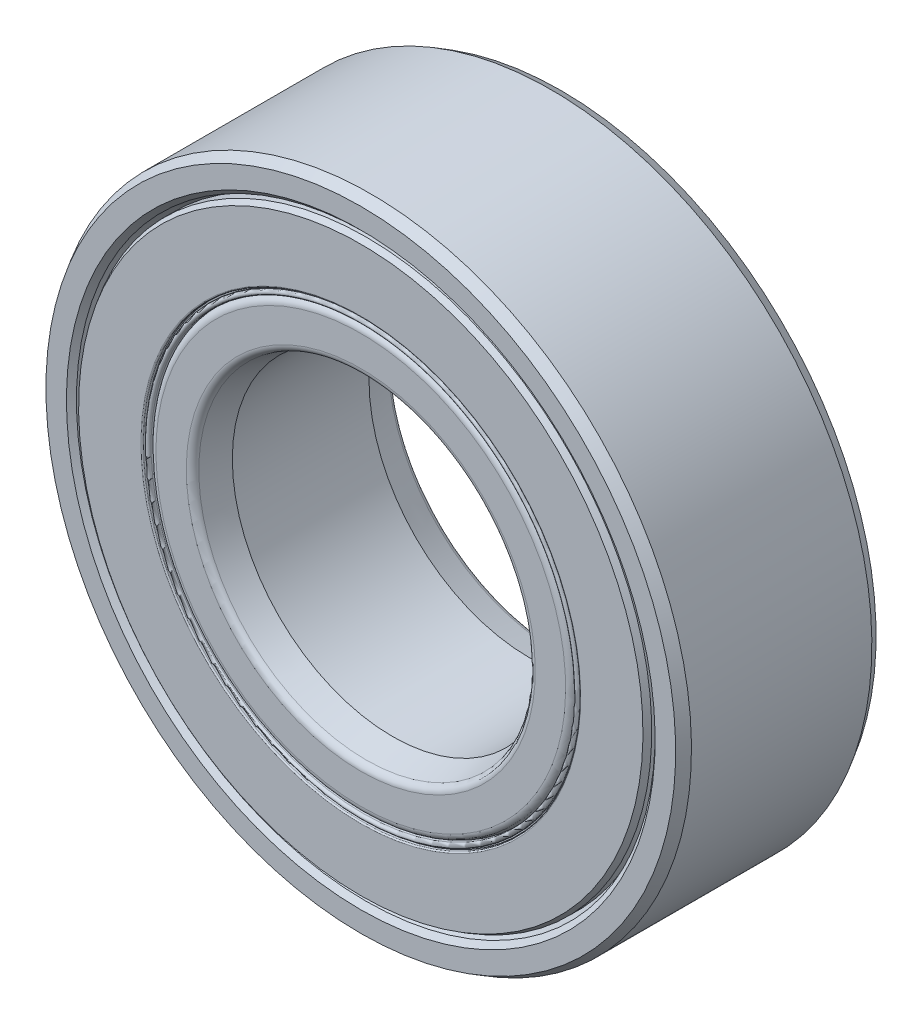
ISO-10303-21;
HEADER;
FILE_DESCRIPTION(('STEP AP214'),'2;1');
FILE_NAME('part.step','',(''),(''),'','','');
FILE_SCHEMA(('AUTOMOTIVE_DESIGN { 1 0 10303 214 1 1 1 1 }'));
ENDSEC;
DATA;
#1=APPLICATION_CONTEXT('core data for automotive mechanical design processes');
#2=APPLICATION_PROTOCOL_DEFINITION('international standard','automotive_design',2000,#1);
#3=PRODUCT_CONTEXT('',#1,'mechanical');
#4=PRODUCT('Part','Part','',(#3));
#5=PRODUCT_RELATED_PRODUCT_CATEGORY('part','',(#4));
#6=PRODUCT_DEFINITION_FORMATION('','',#4);
#7=PRODUCT_DEFINITION_CONTEXT('part definition',#1,'design');
#8=PRODUCT_DEFINITION('design','',#6,#7);
#9=PRODUCT_DEFINITION_SHAPE('','',#8);
#10=(LENGTH_UNIT() NAMED_UNIT(*) SI_UNIT(.MILLI.,.METRE.));
#11=(NAMED_UNIT(*) PLANE_ANGLE_UNIT() SI_UNIT($,.RADIAN.));
#12=(NAMED_UNIT(*) SI_UNIT($,.STERADIAN.) SOLID_ANGLE_UNIT());
#13=UNCERTAINTY_MEASURE_WITH_UNIT(LENGTH_MEASURE(1.E-05),#10,'distance_accuracy_value','');
#14=(GEOMETRIC_REPRESENTATION_CONTEXT(3) GLOBAL_UNCERTAINTY_ASSIGNED_CONTEXT((#13)) GLOBAL_UNIT_ASSIGNED_CONTEXT((#10,
#11,#12)) REPRESENTATION_CONTEXT('',''));
#15=CARTESIAN_POINT('',(0.,0.,0.));
#16=DIRECTION('',(0.,0.,1.));
#17=DIRECTION('',(1.,0.,0.));
#18=AXIS2_PLACEMENT_3D('',#15,#16,#17);
#19=CARTESIAN_POINT('',(0.,5.29333333333333,1.5));
#20=DIRECTION('',(0.,0.,1.));
#21=DIRECTION('',(0.,-1.,0.));
#22=AXIS2_PLACEMENT_3D('',#19,#20,#21);
#23=PLANE('',#22);
#24=CARTESIAN_POINT('',(0.,0.,1.5));
#25=DIRECTION('',(0.,0.,1.));
#26=DIRECTION('',(0.,-1.,0.));
#27=AXIS2_PLACEMENT_3D('',#24,#25,#26);
#28=CIRCLE('',#27,5.45333333333333);
#29=CARTESIAN_POINT('',(0.,-5.45333333333333,1.5));
#30=VERTEX_POINT('',#29);
#31=EDGE_CURVE('E11',#30,#30,#28,.T.);
#32=ORIENTED_EDGE('',*,*,#31,.F.);
#33=EDGE_LOOP('',(#32));
#34=FACE_BOUND('',#33,.T.);
#35=CARTESIAN_POINT('',(0.,0.,1.5));
#36=DIRECTION('',(0.,0.,1.));
#37=DIRECTION('',(0.,-1.,0.));
#38=AXIS2_PLACEMENT_3D('',#35,#36,#37);
#39=CIRCLE('',#38,5.29333333333333);
#40=CARTESIAN_POINT('',(0.,-5.29333333333333,1.5));
#41=VERTEX_POINT('',#40);
#42=EDGE_CURVE('E66',#41,#41,#39,.T.);
#43=ORIENTED_EDGE('',*,*,#42,.T.);
#44=EDGE_LOOP('',(#43));
#45=FACE_BOUND('',#44,.T.);
#46=ADVANCED_FACE('F41',(#34,#45),#23,.F.);
#47=CARTESIAN_POINT('',(0.,0.,2.5));
#48=DIRECTION('',(0.,0.,1.));
#49=DIRECTION('',(0.,-1.,0.));
#50=AXIS2_PLACEMENT_3D('',#47,#48,#49);
#51=CYLINDRICAL_SURFACE('',#50,5.45333333333333);
#52=CARTESIAN_POINT('',(0.,0.,2.37849954654104));
#53=DIRECTION('',(0.,0.,1.));
#54=DIRECTION('',(0.,-1.,0.));
#55=AXIS2_PLACEMENT_3D('',#52,#53,#54);
#56=CIRCLE('',#55,5.45333333333333);
#57=CARTESIAN_POINT('',(0.,-5.45333333333333,2.37849954654104));
#58=VERTEX_POINT('',#57);
#59=EDGE_CURVE('E47',#58,#58,#56,.T.);
#60=ORIENTED_EDGE('',*,*,#59,.F.);
#61=EDGE_LOOP('',(#60));
#62=FACE_BOUND('',#61,.T.);
#63=ORIENTED_EDGE('',*,*,#31,.T.);
#64=EDGE_LOOP('',(#63));
#65=FACE_BOUND('',#64,.T.);
#66=ADVANCED_FACE('F97',(#62,#65),#51,.T.);
#67=CARTESIAN_POINT('',(0.,0.,2.37849954654104));
#68=DIRECTION('',(0.,0.,-1.));
#69=DIRECTION('',(0.,1.,0.));
#70=AXIS2_PLACEMENT_3D('',#67,#68,#69);
#71=CONICAL_SURFACE('',#70,5.45333333333333,0.174532925199416);
#72=CARTESIAN_POINT('',(0.,0.,2.41789185666153));
#73=DIRECTION('',(0.,0.,1.));
#74=DIRECTION('',(0.,-1.,0.));
#75=AXIS2_PLACEMENT_3D('',#72,#73,#74);
#76=CIRCLE('',#75,5.44638740622665);
#77=CARTESIAN_POINT('',(0.,-5.44638740622665,2.41789185666153));
#78=VERTEX_POINT('',#77);
#79=EDGE_CURVE('E51',#78,#78,#76,.T.);
#80=ORIENTED_EDGE('',*,*,#79,.F.);
#81=EDGE_LOOP('',(#80));
#82=FACE_BOUND('',#81,.T.);
#83=ORIENTED_EDGE('',*,*,#59,.T.);
#84=EDGE_LOOP('',(#83));
#85=FACE_BOUND('',#84,.T.);
#86=ADVANCED_FACE('F92',(#82,#85),#71,.T.);
#87=CARTESIAN_POINT('',(0.,0.,2.415));
#88=DIRECTION('',(0.,0.,1.));
#89=DIRECTION('',(0.,-1.,0.));
#90=AXIS2_PLACEMENT_3D('',#87,#88,#89);
#91=TOROIDAL_SURFACE('',#90,5.42998687211721,0.0166535387838736);
#92=CARTESIAN_POINT('',(0.,0.,2.415));
#93=DIRECTION('',(0.,0.,1.));
#94=DIRECTION('',(0.,-1.,0.));
#95=AXIS2_PLACEMENT_3D('',#92,#93,#94);
#96=CIRCLE('',#95,5.41333333333333);
#97=CARTESIAN_POINT('',(0.,-5.41333333333333,2.415));
#98=VERTEX_POINT('',#97);
#99=EDGE_CURVE('E55',#98,#98,#96,.T.);
#100=ORIENTED_EDGE('',*,*,#99,.F.);
#101=EDGE_LOOP('',(#100));
#102=FACE_BOUND('',#101,.T.);
#103=ORIENTED_EDGE('',*,*,#79,.T.);
#104=EDGE_LOOP('',(#103));
#105=FACE_BOUND('',#104,.T.);
#106=ADVANCED_FACE('F86',(#102,#105),#91,.T.);
#107=CARTESIAN_POINT('',(0.,0.,2.5));
#108=DIRECTION('',(0.,0.,1.));
#109=DIRECTION('',(0.,-1.,0.));
#110=AXIS2_PLACEMENT_3D('',#107,#108,#109);
#111=CYLINDRICAL_SURFACE('',#110,5.41333333333333);
#112=CARTESIAN_POINT('',(0.,0.,2.44));
#113=DIRECTION('',(0.,0.,1.));
#114=DIRECTION('',(0.,-1.,0.));
#115=AXIS2_PLACEMENT_3D('',#112,#113,#114);
#116=CIRCLE('',#115,5.41333333333333);
#117=CARTESIAN_POINT('',(0.,-5.41333333333333,2.44));
#118=VERTEX_POINT('',#117);
#119=EDGE_CURVE('E60',#118,#118,#116,.T.);
#120=ORIENTED_EDGE('',*,*,#119,.F.);
#121=EDGE_LOOP('',(#120));
#122=FACE_BOUND('',#121,.T.);
#123=ORIENTED_EDGE('',*,*,#99,.T.);
#124=EDGE_LOOP('',(#123));
#125=FACE_BOUND('',#124,.T.);
#126=ADVANCED_FACE('F80',(#122,#125),#111,.T.);
#127=CARTESIAN_POINT('',(0.,0.,2.44));
#128=DIRECTION('',(0.,0.,1.));
#129=DIRECTION('',(0.,-1.,0.));
#130=AXIS2_PLACEMENT_3D('',#127,#128,#129);
#131=TOROIDAL_SURFACE('',#130,5.35333333333333,0.0600000000000002);
#132=CARTESIAN_POINT('',(0.,0.,2.44));
#133=DIRECTION('',(0.,0.,1.));
#134=DIRECTION('',(0.,-1.,0.));
#135=AXIS2_PLACEMENT_3D('',#132,#133,#134);
#136=CIRCLE('',#135,5.29333333333333);
#137=CARTESIAN_POINT('',(0.,-5.29333333333333,2.44));
#138=VERTEX_POINT('',#137);
#139=EDGE_CURVE('E63',#138,#138,#136,.T.);
#140=ORIENTED_EDGE('',*,*,#139,.F.);
#141=EDGE_LOOP('',(#140));
#142=FACE_BOUND('',#141,.T.);
#143=ORIENTED_EDGE('',*,*,#119,.T.);
#144=EDGE_LOOP('',(#143));
#145=FACE_BOUND('',#144,.T.);
#146=ADVANCED_FACE('F74',(#142,#145),#131,.T.);
#147=CARTESIAN_POINT('',(0.,0.,2.5));
#148=DIRECTION('',(0.,0.,1.));
#149=DIRECTION('',(0.,-1.,0.));
#150=AXIS2_PLACEMENT_3D('',#147,#148,#149);
#151=CYLINDRICAL_SURFACE('',#150,5.29333333333333);
#152=ORIENTED_EDGE('',*,*,#42,.F.);
#153=EDGE_LOOP('',(#152));
#154=FACE_BOUND('',#153,.T.);
#155=ORIENTED_EDGE('',*,*,#139,.T.);
#156=EDGE_LOOP('',(#155));
#157=FACE_BOUND('',#156,.T.);
#158=ADVANCED_FACE('F71',(#154,#157),#151,.F.);
#159=CLOSED_SHELL('',(#46,#66,#86,#106,#126,#146,#158));
#160=MANIFOLD_SOLID_BREP('B2',#159);
#161=CARTESIAN_POINT('',(0.,0.,-2.50000000000001));
#162=DIRECTION('',(0.,0.,1.));
#163=DIRECTION('',(0.,-1.,0.));
#164=AXIS2_PLACEMENT_3D('',#161,#162,#163);
#165=CONICAL_SURFACE('',#164,7.04,0.523598775598303);
#166=CARTESIAN_POINT('',(0.,0.,-2.3614359353945));
#167=DIRECTION('',(0.,0.,1.));
#168=DIRECTION('',(0.,-1.,0.));
#169=AXIS2_PLACEMENT_3D('',#166,#167,#168);
#170=CIRCLE('',#169,7.12);
#171=CARTESIAN_POINT('',(0.,-7.12,-2.3614359353945));
#172=VERTEX_POINT('',#171);
#173=EDGE_CURVE('E177',#172,#172,#170,.T.);
#174=ORIENTED_EDGE('',*,*,#173,.F.);
#175=EDGE_LOOP('',(#174));
#176=FACE_BOUND('',#175,.T.);
#177=CARTESIAN_POINT('',(0.,0.,-2.50000000000001));
#178=DIRECTION('',(0.,0.,1.));
#179=DIRECTION('',(0.,-1.,0.));
#180=AXIS2_PLACEMENT_3D('',#177,#178,#179);
#181=CIRCLE('',#180,7.04);
#182=CARTESIAN_POINT('',(0.,-7.04,-2.50000000000001));
#183=VERTEX_POINT('',#182);
#184=EDGE_CURVE('E40',#183,#183,#181,.T.);
#185=ORIENTED_EDGE('',*,*,#184,.T.);
#186=EDGE_LOOP('',(#185));
#187=FACE_BOUND('',#186,.T.);
#188=ADVANCED_FACE('F155',(#176,#187),#165,.T.);
#189=CARTESIAN_POINT('',(0.,7.04,-2.50000000000001));
#190=DIRECTION('',(0.,0.,1.));
#191=DIRECTION('',(0.,-1.,0.));
#192=AXIS2_PLACEMENT_3D('',#189,#190,#191);
#193=PLANE('',#192);
#194=ORIENTED_EDGE('',*,*,#184,.F.);
#195=EDGE_LOOP('',(#194));
#196=FACE_BOUND('',#195,.T.);
#197=CARTESIAN_POINT('',(0.,0.,-2.50000000000001));
#198=DIRECTION('',(0.,0.,1.));
#199=DIRECTION('',(0.,-1.,0.));
#200=AXIS2_PLACEMENT_3D('',#197,#198,#199);
#201=CIRCLE('',#200,5.48533333333333);
#202=CARTESIAN_POINT('',(0.,-5.48533333333333,-2.50000000000001));
#203=VERTEX_POINT('',#202);
#204=EDGE_CURVE('E161',#203,#203,#201,.T.);
#205=ORIENTED_EDGE('',*,*,#204,.T.);
#206=EDGE_LOOP('',(#205));
#207=FACE_BOUND('',#206,.T.);
#208=ADVANCED_FACE('F184',(#196,#207),#193,.F.);
#209=CARTESIAN_POINT('',(0.,0.,-2.46800000000001));
#210=DIRECTION('',(0.,0.,1.));
#211=DIRECTION('',(0.,-1.,0.));
#212=AXIS2_PLACEMENT_3D('',#209,#210,#211);
#213=TOROIDAL_SURFACE('',#212,5.48533333333333,0.0320000000000006);
#214=ORIENTED_EDGE('',*,*,#204,.F.);
#215=EDGE_LOOP('',(#214));
#216=FACE_BOUND('',#215,.T.);
#217=CARTESIAN_POINT('',(0.,0.,-2.46800000000001));
#218=DIRECTION('',(0.,0.,1.));
#219=DIRECTION('',(0.,-1.,0.));
#220=AXIS2_PLACEMENT_3D('',#217,#218,#219);
#221=CIRCLE('',#220,5.45333333333333);
#222=CARTESIAN_POINT('',(0.,-5.45333333333333,-2.46800000000001));
#223=VERTEX_POINT('',#222);
#224=EDGE_CURVE('E165',#223,#223,#221,.T.);
#225=ORIENTED_EDGE('',*,*,#224,.T.);
#226=EDGE_LOOP('',(#225));
#227=FACE_BOUND('',#226,.T.);
#228=ADVANCED_FACE('F188',(#216,#227),#213,.T.);
#229=CARTESIAN_POINT('',(0.,0.,2.5));
#230=DIRECTION('',(0.,0.,1.));
#231=DIRECTION('',(0.,-1.,0.));
#232=AXIS2_PLACEMENT_3D('',#229,#230,#231);
#233=CYLINDRICAL_SURFACE('',#232,5.45333333333333);
#234=ORIENTED_EDGE('',*,*,#224,.F.);
#235=EDGE_LOOP('',(#234));
#236=FACE_BOUND('',#235,.T.);
#237=CARTESIAN_POINT('',(0.,0.,-1.5));
#238=DIRECTION('',(0.,0.,1.));
#239=DIRECTION('',(0.,-1.,0.));
#240=AXIS2_PLACEMENT_3D('',#237,#238,#239);
#241=CIRCLE('',#240,5.45333333333333);
#242=CARTESIAN_POINT('',(0.,-5.45333333333333,-1.5));
#243=VERTEX_POINT('',#242);
#244=EDGE_CURVE('E169',#243,#243,#241,.T.);
#245=ORIENTED_EDGE('',*,*,#244,.T.);
#246=EDGE_LOOP('',(#245));
#247=FACE_BOUND('',#246,.T.);
#248=ADVANCED_FACE('F193',(#236,#247),#233,.F.);
#249=CARTESIAN_POINT('',(0.,7.12,-1.5));
#250=DIRECTION('',(0.,0.,-1.));
#251=DIRECTION('',(0.,1.,0.));
#252=AXIS2_PLACEMENT_3D('',#249,#250,#251);
#253=PLANE('',#252);
#254=ORIENTED_EDGE('',*,*,#244,.F.);
#255=EDGE_LOOP('',(#254));
#256=FACE_BOUND('',#255,.T.);
#257=CARTESIAN_POINT('',(0.,0.,-1.5));
#258=DIRECTION('',(0.,0.,1.));
#259=DIRECTION('',(0.,-1.,0.));
#260=AXIS2_PLACEMENT_3D('',#257,#258,#259);
#261=CIRCLE('',#260,7.12);
#262=CARTESIAN_POINT('',(0.,-7.12,-1.5));
#263=VERTEX_POINT('',#262);
#264=EDGE_CURVE('E174',#263,#263,#261,.T.);
#265=ORIENTED_EDGE('',*,*,#264,.T.);
#266=EDGE_LOOP('',(#265));
#267=FACE_BOUND('',#266,.T.);
#268=ADVANCED_FACE('F199',(#256,#267),#253,.F.);
#269=CARTESIAN_POINT('',(0.,0.,2.5));
#270=DIRECTION('',(0.,0.,1.));
#271=DIRECTION('',(0.,-1.,0.));
#272=AXIS2_PLACEMENT_3D('',#269,#270,#271);
#273=CYLINDRICAL_SURFACE('',#272,7.12);
#274=ORIENTED_EDGE('',*,*,#264,.F.);
#275=EDGE_LOOP('',(#274));
#276=FACE_BOUND('',#275,.T.);
#277=ORIENTED_EDGE('',*,*,#173,.T.);
#278=EDGE_LOOP('',(#277));
#279=FACE_BOUND('',#278,.T.);
#280=ADVANCED_FACE('F181',(#276,#279),#273,.T.);
#281=CLOSED_SHELL('',(#188,#208,#228,#248,#268,#280));
#282=MANIFOLD_SOLID_BREP('B6',#281);
#283=CARTESIAN_POINT('',(0.,7.12,1.5));
#284=DIRECTION('',(0.,0.,1.));
#285=DIRECTION('',(0.,-1.,0.));
#286=AXIS2_PLACEMENT_3D('',#283,#284,#285);
#287=PLANE('',#286);
#288=CARTESIAN_POINT('',(0.,0.,1.5));
#289=DIRECTION('',(0.,0.,1.));
#290=DIRECTION('',(0.,-1.,0.));
#291=AXIS2_PLACEMENT_3D('',#288,#289,#290);
#292=CIRCLE('',#291,7.12);
#293=CARTESIAN_POINT('',(0.,-7.12,1.5));
#294=VERTEX_POINT('',#293);
#295=EDGE_CURVE('E154',#294,#294,#292,.T.);
#296=ORIENTED_EDGE('',*,*,#295,.F.);
#297=EDGE_LOOP('',(#296));
#298=FACE_BOUND('',#297,.T.);
#299=CARTESIAN_POINT('',(0.,0.,1.5));
#300=DIRECTION('',(0.,0.,1.));
#301=DIRECTION('',(0.,-1.,0.));
#302=AXIS2_PLACEMENT_3D('',#299,#300,#301);
#303=CIRCLE('',#302,5.45333333333333);
#304=CARTESIAN_POINT('',(0.,-5.45333333333333,1.5));
#305=VERTEX_POINT('',#304);
#306=EDGE_CURVE('E274',#305,#305,#303,.T.);
#307=ORIENTED_EDGE('',*,*,#306,.T.);
#308=EDGE_LOOP('',(#307));
#309=FACE_BOUND('',#308,.T.);
#310=ADVANCED_FACE('F252',(#298,#309),#287,.F.);
#311=CARTESIAN_POINT('',(0.,0.,2.5));
#312=DIRECTION('',(0.,0.,1.));
#313=DIRECTION('',(0.,-1.,0.));
#314=AXIS2_PLACEMENT_3D('',#311,#312,#313);
#315=CYLINDRICAL_SURFACE('',#314,7.12);
#316=CARTESIAN_POINT('',(0.,0.,2.36143593539449));
#317=DIRECTION('',(0.,0.,1.));
#318=DIRECTION('',(0.,-1.,0.));
#319=AXIS2_PLACEMENT_3D('',#316,#317,#318);
#320=CIRCLE('',#319,7.12);
#321=CARTESIAN_POINT('',(0.,-7.12,2.36143593539449));
#322=VERTEX_POINT('',#321);
#323=EDGE_CURVE('E258',#322,#322,#320,.T.);
#324=ORIENTED_EDGE('',*,*,#323,.F.);
#325=EDGE_LOOP('',(#324));
#326=FACE_BOUND('',#325,.T.);
#327=ORIENTED_EDGE('',*,*,#295,.T.);
#328=EDGE_LOOP('',(#327));
#329=FACE_BOUND('',#328,.T.);
#330=ADVANCED_FACE('F299',(#326,#329),#315,.T.);
#331=CARTESIAN_POINT('',(0.,0.,2.36143593539449));
#332=DIRECTION('',(0.,0.,-1.));
#333=DIRECTION('',(0.,1.,0.));
#334=AXIS2_PLACEMENT_3D('',#331,#332,#333);
#335=CONICAL_SURFACE('',#334,7.12,0.523598775598299);
#336=CARTESIAN_POINT('',(0.,0.,2.5));
#337=DIRECTION('',(0.,0.,1.));
#338=DIRECTION('',(0.,-1.,0.));
#339=AXIS2_PLACEMENT_3D('',#336,#337,#338);
#340=CIRCLE('',#339,7.04);
#341=CARTESIAN_POINT('',(0.,-7.04,2.5));
#342=VERTEX_POINT('',#341);
#343=EDGE_CURVE('E262',#342,#342,#340,.T.);
#344=ORIENTED_EDGE('',*,*,#343,.F.);
#345=EDGE_LOOP('',(#344));
#346=FACE_BOUND('',#345,.T.);
#347=ORIENTED_EDGE('',*,*,#323,.T.);
#348=EDGE_LOOP('',(#347));
#349=FACE_BOUND('',#348,.T.);
#350=ADVANCED_FACE('F294',(#346,#349),#335,.T.);
#351=CARTESIAN_POINT('',(0.,7.04,2.5));
#352=DIRECTION('',(0.,0.,-1.));
#353=DIRECTION('',(0.,1.,0.));
#354=AXIS2_PLACEMENT_3D('',#351,#352,#353);
#355=PLANE('',#354);
#356=CARTESIAN_POINT('',(0.,0.,2.5));
#357=DIRECTION('',(0.,0.,1.));
#358=DIRECTION('',(0.,-1.,0.));
#359=AXIS2_PLACEMENT_3D('',#356,#357,#358);
#360=CIRCLE('',#359,5.48533333333333);
#361=CARTESIAN_POINT('',(0.,-5.48533333333333,2.5));
#362=VERTEX_POINT('',#361);
#363=EDGE_CURVE('E266',#362,#362,#360,.T.);
#364=ORIENTED_EDGE('',*,*,#363,.F.);
#365=EDGE_LOOP('',(#364));
#366=FACE_BOUND('',#365,.T.);
#367=ORIENTED_EDGE('',*,*,#343,.T.);
#368=EDGE_LOOP('',(#367));
#369=FACE_BOUND('',#368,.T.);
#370=ADVANCED_FACE('F288',(#366,#369),#355,.F.);
#371=CARTESIAN_POINT('',(0.,0.,2.468));
#372=DIRECTION('',(0.,0.,1.));
#373=DIRECTION('',(0.,-1.,0.));
#374=AXIS2_PLACEMENT_3D('',#371,#372,#373);
#375=TOROIDAL_SURFACE('',#374,5.48533333333333,0.0320000000000006);
#376=CARTESIAN_POINT('',(0.,0.,2.468));
#377=DIRECTION('',(0.,0.,1.));
#378=DIRECTION('',(0.,-1.,0.));
#379=AXIS2_PLACEMENT_3D('',#376,#377,#378);
#380=CIRCLE('',#379,5.45333333333333);
#381=CARTESIAN_POINT('',(0.,-5.45333333333333,2.468));
#382=VERTEX_POINT('',#381);
#383=EDGE_CURVE('E271',#382,#382,#380,.T.);
#384=ORIENTED_EDGE('',*,*,#383,.F.);
#385=EDGE_LOOP('',(#384));
#386=FACE_BOUND('',#385,.T.);
#387=ORIENTED_EDGE('',*,*,#363,.T.);
#388=EDGE_LOOP('',(#387));
#389=FACE_BOUND('',#388,.T.);
#390=ADVANCED_FACE('F282',(#386,#389),#375,.T.);
#391=CARTESIAN_POINT('',(0.,0.,2.5));
#392=DIRECTION('',(0.,0.,1.));
#393=DIRECTION('',(0.,-1.,0.));
#394=AXIS2_PLACEMENT_3D('',#391,#392,#393);
#395=CYLINDRICAL_SURFACE('',#394,5.45333333333333);
#396=ORIENTED_EDGE('',*,*,#306,.F.);
#397=EDGE_LOOP('',(#396));
#398=FACE_BOUND('',#397,.T.);
#399=ORIENTED_EDGE('',*,*,#383,.T.);
#400=EDGE_LOOP('',(#399));
#401=FACE_BOUND('',#400,.T.);
#402=ADVANCED_FACE('F279',(#398,#401),#395,.F.);
#403=CLOSED_SHELL('',(#310,#330,#350,#370,#390,#402));
#404=MANIFOLD_SOLID_BREP('B35',#403);
#405=CARTESIAN_POINT('',(-3.98956843078773,4.75458251029184,0.));
#406=DIRECTION('',(0.,0.,1.));
#407=DIRECTION('',(-0.64278760968653,0.766044443118986,0.));
#408=AXIS2_PLACEMENT_3D('',#405,#406,#407);
#409=SPHERICAL_SURFACE('',#408,1.5);
#410=CARTESIAN_POINT('',(-3.98956843078773,4.75458251029184,1.5));
#411=VERTEX_POINT('',#410);
#412=VERTEX_LOOP('',#411);
#413=FACE_BOUND('',#412,.T.);
#414=ADVANCED_FACE('F362',(#413),#409,.T.);
#415=CLOSED_SHELL('',(#414));
#416=MANIFOLD_SOLID_BREP('B149',#415);
#417=CARTESIAN_POINT('',(-6.11237345369576,1.07777635605281,0.));
#418=DIRECTION('',(0.,0.,1.));
#419=DIRECTION('',(-0.984807753012206,0.17364817766694,0.));
#420=AXIS2_PLACEMENT_3D('',#417,#418,#419);
#421=SPHERICAL_SURFACE('',#420,1.5);
#422=CARTESIAN_POINT('',(-6.11237345369576,1.07777635605281,1.5));
#423=VERTEX_POINT('',#422);
#424=VERTEX_LOOP('',#423);
#425=FACE_BOUND('',#424,.T.);
#426=ADVANCED_FACE('F380',(#425),#421,.T.);
#427=CLOSED_SHELL('',(#426));
#428=MANIFOLD_SOLID_BREP('B248',#427);
#429=CARTESIAN_POINT('',(-5.37513100615544,-3.10333333333328,0.));
#430=DIRECTION('',(0.,0.,1.));
#431=DIRECTION('',(-0.866025403784443,-0.499999999999992,0.));
#432=AXIS2_PLACEMENT_3D('',#429,#430,#431);
#433=SPHERICAL_SURFACE('',#432,1.5);
#434=CARTESIAN_POINT('',(-5.37513100615544,-3.10333333333328,1.5));
#435=VERTEX_POINT('',#434);
#436=VERTEX_LOOP('',#435);
#437=FACE_BOUND('',#436,.T.);
#438=ADVANCED_FACE('F398',(#437),#433,.T.);
#439=CLOSED_SHELL('',(#438));
#440=MANIFOLD_SOLID_BREP('B358',#439);
#441=CARTESIAN_POINT('',(-2.12280502290803,-5.83235886634452,0.));
#442=DIRECTION('',(0.,0.,1.));
#443=DIRECTION('',(-0.342020143325676,-0.939692620785906,0.));
#444=AXIS2_PLACEMENT_3D('',#441,#442,#443);
#445=SPHERICAL_SURFACE('',#444,1.5);
#446=CARTESIAN_POINT('',(-2.12280502290803,-5.83235886634452,1.5));
#447=VERTEX_POINT('',#446);
#448=VERTEX_LOOP('',#447);
#449=FACE_BOUND('',#448,.T.);
#450=ADVANCED_FACE('F416',(#449),#445,.T.);
#451=CLOSED_SHELL('',(#450));
#452=MANIFOLD_SOLID_BREP('B376',#451);
#453=CARTESIAN_POINT('',(2.12280502290795,-5.83235886634455,0.));
#454=DIRECTION('',(0.,0.,1.));
#455=DIRECTION('',(0.342020143325663,-0.939692620785911,0.));
#456=AXIS2_PLACEMENT_3D('',#453,#454,#455);
#457=SPHERICAL_SURFACE('',#456,1.5);
#458=CARTESIAN_POINT('',(2.12280502290795,-5.83235886634455,1.5));
#459=VERTEX_POINT('',#458);
#460=VERTEX_LOOP('',#459);
#461=FACE_BOUND('',#460,.T.);
#462=ADVANCED_FACE('F434',(#461),#457,.T.);
#463=CLOSED_SHELL('',(#462));
#464=MANIFOLD_SOLID_BREP('B394',#463);
#465=CARTESIAN_POINT('',(5.3751310061554,-3.10333333333336,0.));
#466=DIRECTION('',(0.,0.,1.));
#467=DIRECTION('',(0.866025403784436,-0.500000000000004,0.));
#468=AXIS2_PLACEMENT_3D('',#465,#466,#467);
#469=SPHERICAL_SURFACE('',#468,1.5);
#470=CARTESIAN_POINT('',(5.3751310061554,-3.10333333333336,1.5));
#471=VERTEX_POINT('',#470);
#472=VERTEX_LOOP('',#471);
#473=FACE_BOUND('',#472,.T.);
#474=ADVANCED_FACE('F452',(#473),#469,.T.);
#475=CLOSED_SHELL('',(#474));
#476=MANIFOLD_SOLID_BREP('B412',#475);
#477=CARTESIAN_POINT('',(6.11237345369578,1.07777635605273,0.));
#478=DIRECTION('',(0.,0.,1.));
#479=DIRECTION('',(0.984807753012209,0.173648177666927,0.));
#480=AXIS2_PLACEMENT_3D('',#477,#478,#479);
#481=SPHERICAL_SURFACE('',#480,1.5);
#482=CARTESIAN_POINT('',(6.11237345369578,1.07777635605273,1.5));
#483=VERTEX_POINT('',#482);
#484=VERTEX_LOOP('',#483);
#485=FACE_BOUND('',#484,.T.);
#486=ADVANCED_FACE('F470',(#485),#481,.T.);
#487=CLOSED_SHELL('',(#486));
#488=MANIFOLD_SOLID_BREP('B430',#487);
#489=CARTESIAN_POINT('',(3.9895684307878,4.75458251029179,0.));
#490=DIRECTION('',(0.,0.,1.));
#491=DIRECTION('',(0.642787609686541,0.766044443118977,0.));
#492=AXIS2_PLACEMENT_3D('',#489,#490,#491);
#493=SPHERICAL_SURFACE('',#492,1.5);
#494=CARTESIAN_POINT('',(3.9895684307878,4.75458251029179,1.5));
#495=VERTEX_POINT('',#494);
#496=VERTEX_LOOP('',#495);
#497=FACE_BOUND('',#496,.T.);
#498=ADVANCED_FACE('F488',(#497),#493,.T.);
#499=CLOSED_SHELL('',(#498));
#500=MANIFOLD_SOLID_BREP('B448',#499);
#501=CARTESIAN_POINT('',(0.,6.20666666666667,0.));
#502=DIRECTION('',(0.,0.,1.));
#503=DIRECTION('',(0.,1.,0.));
#504=AXIS2_PLACEMENT_3D('',#501,#502,#503);
#505=SPHERICAL_SURFACE('',#504,1.5);
#506=CARTESIAN_POINT('',(0.,6.20666666666667,1.5));
#507=VERTEX_POINT('',#506);
#508=VERTEX_LOOP('',#507);
#509=FACE_BOUND('',#508,.T.);
#510=ADVANCED_FACE('F508',(#509),#505,.T.);
#511=CLOSED_SHELL('',(#510));
#512=MANIFOLD_SOLID_BREP('B466',#511);
#513=CARTESIAN_POINT('',(0.,0.,-2.31710120812756));
#514=DIRECTION('',(0.,0.,1.));
#515=DIRECTION('',(0.,-1.,0.));
#516=AXIS2_PLACEMENT_3D('',#513,#514,#515);
#517=TOROIDAL_SURFACE('',#516,4.35333333333333,0.182898791872448);
#518=CARTESIAN_POINT('',(0.,0.,-2.50000000000001));
#519=DIRECTION('',(0.,0.,1.));
#520=DIRECTION('',(0.,-1.,0.));
#521=AXIS2_PLACEMENT_3D('',#518,#519,#520);
#522=CIRCLE('',#521,4.35333333333333);
#523=CARTESIAN_POINT('',(0.,-4.35333333333333,-2.50000000000001));
#524=VERTEX_POINT('',#523);
#525=EDGE_CURVE('E507',#524,#524,#522,.T.);
#526=ORIENTED_EDGE('',*,*,#525,.F.);
#527=EDGE_LOOP('',(#526));
#528=FACE_BOUND('',#527,.T.);
#529=CARTESIAN_POINT('',(0.,0.,-2.36443889879039));
#530=DIRECTION('',(0.,0.,1.));
#531=DIRECTION('',(0.,-1.,0.));
#532=AXIS2_PLACEMENT_3D('',#529,#530,#531);
#533=CIRCLE('',#532,4.17666666666666);
#534=CARTESIAN_POINT('',(0.,-4.17666666666666,-2.36443889879039));
#535=VERTEX_POINT('',#534);
#536=EDGE_CURVE('E567',#535,#535,#533,.T.);
#537=ORIENTED_EDGE('',*,*,#536,.T.);
#538=EDGE_LOOP('',(#537));
#539=FACE_BOUND('',#538,.T.);
#540=ADVANCED_FACE('F527',(#528,#539),#517,.T.);
#541=CARTESIAN_POINT('',(0.,4.35333333333333,-2.5));
#542=DIRECTION('',(0.,0.,1.));
#543=DIRECTION('',(0.,-1.,0.));
#544=AXIS2_PLACEMENT_3D('',#541,#542,#543);
#545=PLANE('',#544);
#546=CARTESIAN_POINT('',(0.,0.,-2.5));
#547=DIRECTION('',(0.,0.,1.));
#548=DIRECTION('',(0.,-1.,0.));
#549=AXIS2_PLACEMENT_3D('',#546,#547,#548);
#550=CIRCLE('',#549,5.11043454146089);
#551=CARTESIAN_POINT('',(0.,-5.11043454146089,-2.5));
#552=VERTEX_POINT('',#551);
#553=EDGE_CURVE('E533',#552,#552,#550,.T.);
#554=ORIENTED_EDGE('',*,*,#553,.F.);
#555=EDGE_LOOP('',(#554));
#556=FACE_BOUND('',#555,.T.);
#557=ORIENTED_EDGE('',*,*,#525,.T.);
#558=EDGE_LOOP('',(#557));
#559=FACE_BOUND('',#558,.T.);
#560=ADVANCED_FACE('F628',(#556,#559),#545,.F.);
#561=CARTESIAN_POINT('',(0.,0.,-2.31710120812756));
#562=DIRECTION('',(0.,0.,1.));
#563=DIRECTION('',(0.,-1.,0.));
#564=AXIS2_PLACEMENT_3D('',#561,#562,#563);
#565=TOROIDAL_SURFACE('',#564,5.11043454146089,0.182898791872447);
#566=CARTESIAN_POINT('',(0.,0.,-2.31710120812756));
#567=DIRECTION('',(0.,0.,1.));
#568=DIRECTION('',(0.,-1.,0.));
#569=AXIS2_PLACEMENT_3D('',#566,#567,#568);
#570=CIRCLE('',#569,5.29333333333333);
#571=CARTESIAN_POINT('',(0.,-5.29333333333333,-2.31710120812756));
#572=VERTEX_POINT('',#571);
#573=EDGE_CURVE('E537',#572,#572,#570,.T.);
#574=ORIENTED_EDGE('',*,*,#573,.F.);
#575=EDGE_LOOP('',(#574));
#576=FACE_BOUND('',#575,.T.);
#577=ORIENTED_EDGE('',*,*,#553,.T.);
#578=EDGE_LOOP('',(#577));
#579=FACE_BOUND('',#578,.T.);
#580=ADVANCED_FACE('F623',(#576,#579),#565,.T.);
#581=CARTESIAN_POINT('',(0.,0.,2.5));
#582=DIRECTION('',(0.,0.,1.));
#583=DIRECTION('',(0.,-1.,0.));
#584=AXIS2_PLACEMENT_3D('',#581,#582,#583);
#585=CYLINDRICAL_SURFACE('',#584,5.29333333333333);
#586=CARTESIAN_POINT('',(0.,0.,-1.1898832809239));
#587=DIRECTION('',(0.,0.,1.));
#588=DIRECTION('',(0.,-1.,0.));
#589=AXIS2_PLACEMENT_3D('',#586,#587,#588);
#590=CIRCLE('',#589,5.29333333333333);
#591=CARTESIAN_POINT('',(0.,-5.29333333333333,-1.1898832809239));
#592=VERTEX_POINT('',#591);
#593=EDGE_CURVE('E541',#592,#592,#590,.T.);
#594=ORIENTED_EDGE('',*,*,#593,.F.);
#595=EDGE_LOOP('',(#594));
#596=FACE_BOUND('',#595,.T.);
#597=ORIENTED_EDGE('',*,*,#573,.T.);
#598=EDGE_LOOP('',(#597));
#599=FACE_BOUND('',#598,.T.);
#600=ADVANCED_FACE('F617',(#596,#599),#585,.T.);
#601=CARTESIAN_POINT('',(0.,0.,0.));
#602=DIRECTION('',(0.,0.,1.));
#603=DIRECTION('',(0.,-1.,0.));
#604=AXIS2_PLACEMENT_3D('',#601,#602,#603);
#605=TOROIDAL_SURFACE('',#604,6.20666666666667,1.5);
#606=CARTESIAN_POINT('',(0.,0.,1.1898832809239));
#607=DIRECTION('',(0.,0.,1.));
#608=DIRECTION('',(0.,-1.,0.));
#609=AXIS2_PLACEMENT_3D('',#606,#607,#608);
#610=CIRCLE('',#609,5.29333333333333);
#611=CARTESIAN_POINT('',(0.,-5.29333333333333,1.1898832809239));
#612=VERTEX_POINT('',#611);
#613=EDGE_CURVE('E546',#612,#612,#610,.T.);
#614=ORIENTED_EDGE('',*,*,#613,.F.);
#615=EDGE_LOOP('',(#614));
#616=FACE_BOUND('',#615,.T.);
#617=ORIENTED_EDGE('',*,*,#593,.T.);
#618=EDGE_LOOP('',(#617));
#619=FACE_BOUND('',#618,.T.);
#620=ADVANCED_FACE('F611',(#616,#619),#605,.F.);
#621=CARTESIAN_POINT('',(0.,0.,2.5));
#622=DIRECTION('',(0.,0.,1.));
#623=DIRECTION('',(0.,-1.,0.));
#624=AXIS2_PLACEMENT_3D('',#621,#622,#623);
#625=CYLINDRICAL_SURFACE('',#624,5.29333333333333);
#626=CARTESIAN_POINT('',(0.,0.,2.31710120812755));
#627=DIRECTION('',(0.,0.,1.));
#628=DIRECTION('',(0.,-1.,0.));
#629=AXIS2_PLACEMENT_3D('',#626,#627,#628);
#630=CIRCLE('',#629,5.29333333333333);
#631=CARTESIAN_POINT('',(0.,-5.29333333333333,2.31710120812755));
#632=VERTEX_POINT('',#631);
#633=EDGE_CURVE('E549',#632,#632,#630,.T.);
#634=ORIENTED_EDGE('',*,*,#633,.F.);
#635=EDGE_LOOP('',(#634));
#636=FACE_BOUND('',#635,.T.);
#637=ORIENTED_EDGE('',*,*,#613,.T.);
#638=EDGE_LOOP('',(#637));
#639=FACE_BOUND('',#638,.T.);
#640=ADVANCED_FACE('F605',(#636,#639),#625,.T.);
#641=CARTESIAN_POINT('',(0.,0.,2.31710120812755));
#642=DIRECTION('',(0.,0.,1.));
#643=DIRECTION('',(0.,-1.,0.));
#644=AXIS2_PLACEMENT_3D('',#641,#642,#643);
#645=TOROIDAL_SURFACE('',#644,5.11043454146089,0.182898791872447);
#646=CARTESIAN_POINT('',(0.,0.,2.5));
#647=DIRECTION('',(0.,0.,1.));
#648=DIRECTION('',(0.,-1.,0.));
#649=AXIS2_PLACEMENT_3D('',#646,#647,#648);
#650=CIRCLE('',#649,5.11043454146089);
#651=CARTESIAN_POINT('',(0.,-5.11043454146089,2.5));
#652=VERTEX_POINT('',#651);
#653=EDGE_CURVE('E552',#652,#652,#650,.T.);
#654=ORIENTED_EDGE('',*,*,#653,.F.);
#655=EDGE_LOOP('',(#654));
#656=FACE_BOUND('',#655,.T.);
#657=ORIENTED_EDGE('',*,*,#633,.T.);
#658=EDGE_LOOP('',(#657));
#659=FACE_BOUND('',#658,.T.);
#660=ADVANCED_FACE('F599',(#656,#659),#645,.T.);
#661=CARTESIAN_POINT('',(0.,4.35333333333333,2.5));
#662=DIRECTION('',(0.,0.,-1.));
#663=DIRECTION('',(0.,1.,0.));
#664=AXIS2_PLACEMENT_3D('',#661,#662,#663);
#665=PLANE('',#664);
#666=CARTESIAN_POINT('',(0.,0.,2.5));
#667=DIRECTION('',(0.,0.,1.));
#668=DIRECTION('',(0.,-1.,0.));
#669=AXIS2_PLACEMENT_3D('',#666,#667,#668);
#670=CIRCLE('',#669,4.35333333333333);
#671=CARTESIAN_POINT('',(0.,-4.35333333333333,2.5));
#672=VERTEX_POINT('',#671);
#673=EDGE_CURVE('E555',#672,#672,#670,.T.);
#674=ORIENTED_EDGE('',*,*,#673,.F.);
#675=EDGE_LOOP('',(#674));
#676=FACE_BOUND('',#675,.T.);
#677=ORIENTED_EDGE('',*,*,#653,.T.);
#678=EDGE_LOOP('',(#677));
#679=FACE_BOUND('',#678,.T.);
#680=ADVANCED_FACE('F593',(#676,#679),#665,.F.);
#681=CARTESIAN_POINT('',(0.,0.,2.31710120812755));
#682=DIRECTION('',(0.,0.,1.));
#683=DIRECTION('',(0.,-1.,0.));
#684=AXIS2_PLACEMENT_3D('',#681,#682,#683);
#685=TOROIDAL_SURFACE('',#684,4.35333333333333,0.182898791872449);
#686=CARTESIAN_POINT('',(0.,0.,2.36443889879039));
#687=DIRECTION('',(0.,0.,1.));
#688=DIRECTION('',(0.,-1.,0.));
#689=AXIS2_PLACEMENT_3D('',#686,#687,#688);
#690=CIRCLE('',#689,4.17666666666667);
#691=CARTESIAN_POINT('',(0.,-4.17666666666667,2.36443889879039));
#692=VERTEX_POINT('',#691);
#693=EDGE_CURVE('E558',#692,#692,#690,.T.);
#694=ORIENTED_EDGE('',*,*,#693,.F.);
#695=EDGE_LOOP('',(#694));
#696=FACE_BOUND('',#695,.T.);
#697=ORIENTED_EDGE('',*,*,#673,.T.);
#698=EDGE_LOOP('',(#697));
#699=FACE_BOUND('',#698,.T.);
#700=ADVANCED_FACE('F587',(#696,#699),#685,.T.);
#701=CARTESIAN_POINT('',(0.,0.,2.36443889879039));
#702=DIRECTION('',(0.,0.,1.));
#703=DIRECTION('',(0.,-1.,0.));
#704=AXIS2_PLACEMENT_3D('',#701,#702,#703);
#705=CONICAL_SURFACE('',#704,4.17666666666667,0.26179938779915);
#706=CARTESIAN_POINT('',(0.,0.,1.70510992278655));
#707=DIRECTION('',(0.,0.,1.));
#708=DIRECTION('',(0.,-1.,0.));
#709=AXIS2_PLACEMENT_3D('',#706,#707,#708);
#710=CIRCLE('',#709,4.);
#711=CARTESIAN_POINT('',(0.,-4.,1.70510992278655));
#712=VERTEX_POINT('',#711);
#713=EDGE_CURVE('E561',#712,#712,#710,.T.);
#714=ORIENTED_EDGE('',*,*,#713,.F.);
#715=EDGE_LOOP('',(#714));
#716=FACE_BOUND('',#715,.T.);
#717=ORIENTED_EDGE('',*,*,#693,.T.);
#718=EDGE_LOOP('',(#717));
#719=FACE_BOUND('',#718,.T.);
#720=ADVANCED_FACE('F581',(#716,#719),#705,.F.);
#721=CARTESIAN_POINT('',(0.,0.,2.5));
#722=DIRECTION('',(0.,0.,1.));
#723=DIRECTION('',(0.,-1.,0.));
#724=AXIS2_PLACEMENT_3D('',#721,#722,#723);
#725=CYLINDRICAL_SURFACE('',#724,4.);
#726=CARTESIAN_POINT('',(0.,0.,-1.70510992278656));
#727=DIRECTION('',(0.,0.,1.));
#728=DIRECTION('',(0.,-1.,0.));
#729=AXIS2_PLACEMENT_3D('',#726,#727,#728);
#730=CIRCLE('',#729,4.);
#731=CARTESIAN_POINT('',(0.,-4.,-1.70510992278656));
#732=VERTEX_POINT('',#731);
#733=EDGE_CURVE('E564',#732,#732,#730,.T.);
#734=ORIENTED_EDGE('',*,*,#733,.F.);
#735=EDGE_LOOP('',(#734));
#736=FACE_BOUND('',#735,.T.);
#737=ORIENTED_EDGE('',*,*,#713,.T.);
#738=EDGE_LOOP('',(#737));
#739=FACE_BOUND('',#738,.T.);
#740=ADVANCED_FACE('F575',(#736,#739),#725,.F.);
#741=CARTESIAN_POINT('',(0.,0.,-1.70510992278656));
#742=DIRECTION('',(0.,0.,-1.));
#743=DIRECTION('',(0.,1.,0.));
#744=AXIS2_PLACEMENT_3D('',#741,#742,#743);
#745=CONICAL_SURFACE('',#744,4.,0.26179938779915);
#746=ORIENTED_EDGE('',*,*,#536,.F.);
#747=EDGE_LOOP('',(#746));
#748=FACE_BOUND('',#747,.T.);
#749=ORIENTED_EDGE('',*,*,#733,.T.);
#750=EDGE_LOOP('',(#749));
#751=FACE_BOUND('',#750,.T.);
#752=ADVANCED_FACE('F572',(#748,#751),#745,.F.);
#753=CLOSED_SHELL('',(#540,#560,#580,#600,#620,#640,#660,#680,#700,#720,#740,#752));
#754=MANIFOLD_SOLID_BREP('B484',#753);
#755=CARTESIAN_POINT('',(0.,0.,2.5));
#756=DIRECTION('',(0.,0.,1.));
#757=DIRECTION('',(0.,-1.,0.));
#758=AXIS2_PLACEMENT_3D('',#755,#756,#757);
#759=CYLINDRICAL_SURFACE('',#758,7.12);
#760=CARTESIAN_POINT('',(0.,0.,1.1898832809239));
#761=DIRECTION('',(0.,0.,1.));
#762=DIRECTION('',(0.,-1.,0.));
#763=AXIS2_PLACEMENT_3D('',#760,#761,#762);
#764=CIRCLE('',#763,7.12);
#765=CARTESIAN_POINT('',(0.,-7.12,1.18988328092389));
#766=VERTEX_POINT('',#765);
#767=EDGE_CURVE('E526',#766,#766,#764,.T.);
#768=ORIENTED_EDGE('',*,*,#767,.F.);
#769=EDGE_LOOP('',(#768));
#770=FACE_BOUND('',#769,.T.);
#771=CARTESIAN_POINT('',(0.,0.,2.10373410621688));
#772=DIRECTION('',(0.,0.,1.));
#773=DIRECTION('',(0.,-1.,0.));
#774=AXIS2_PLACEMENT_3D('',#771,#772,#773);
#775=CIRCLE('',#774,7.12);
#776=CARTESIAN_POINT('',(0.,-7.12,2.10373410621688));
#777=VERTEX_POINT('',#776);
#778=EDGE_CURVE('E748',#777,#777,#775,.T.);
#779=ORIENTED_EDGE('',*,*,#778,.T.);
#780=EDGE_LOOP('',(#779));
#781=FACE_BOUND('',#780,.T.);
#782=ADVANCED_FACE('F708',(#770,#781),#759,.F.);
#783=CARTESIAN_POINT('',(0.,0.,0.));
#784=DIRECTION('',(0.,0.,1.));
#785=DIRECTION('',(0.,-1.,0.));
#786=AXIS2_PLACEMENT_3D('',#783,#784,#785);
#787=TOROIDAL_SURFACE('',#786,6.20666666666667,1.5);
#788=CARTESIAN_POINT('',(0.,0.,-1.1898832809239));
#789=DIRECTION('',(0.,0.,1.));
#790=DIRECTION('',(0.,-1.,0.));
#791=AXIS2_PLACEMENT_3D('',#788,#789,#790);
#792=CIRCLE('',#791,7.12);
#793=CARTESIAN_POINT('',(0.,-7.12,-1.1898832809239));
#794=VERTEX_POINT('',#793);
#795=EDGE_CURVE('E714',#794,#794,#792,.T.);
#796=ORIENTED_EDGE('',*,*,#795,.F.);
#797=EDGE_LOOP('',(#796));
#798=FACE_BOUND('',#797,.T.);
#799=ORIENTED_EDGE('',*,*,#767,.T.);
#800=EDGE_LOOP('',(#799));
#801=FACE_BOUND('',#800,.T.);
#802=ADVANCED_FACE('F809',(#798,#801),#787,.F.);
#803=CARTESIAN_POINT('',(0.,0.,2.5));
#804=DIRECTION('',(0.,0.,1.));
#805=DIRECTION('',(0.,-1.,0.));
#806=AXIS2_PLACEMENT_3D('',#803,#804,#805);
#807=CYLINDRICAL_SURFACE('',#806,7.12);
#808=CARTESIAN_POINT('',(0.,0.,-2.10373410621688));
#809=DIRECTION('',(0.,0.,1.));
#810=DIRECTION('',(0.,-1.,0.));
#811=AXIS2_PLACEMENT_3D('',#808,#809,#810);
#812=CIRCLE('',#811,7.12);
#813=CARTESIAN_POINT('',(0.,-7.12,-2.10373410621688));
#814=VERTEX_POINT('',#813);
#815=EDGE_CURVE('E718',#814,#814,#812,.T.);
#816=ORIENTED_EDGE('',*,*,#815,.F.);
#817=EDGE_LOOP('',(#816));
#818=FACE_BOUND('',#817,.T.);
#819=ORIENTED_EDGE('',*,*,#795,.T.);
#820=EDGE_LOOP('',(#819));
#821=FACE_BOUND('',#820,.T.);
#822=ADVANCED_FACE('F804',(#818,#821),#807,.F.);
#823=CARTESIAN_POINT('',(0.,0.,-2.10373410621688));
#824=DIRECTION('',(0.,0.,-1.));
#825=DIRECTION('',(0.,1.,0.));
#826=AXIS2_PLACEMENT_3D('',#823,#824,#825);
#827=CONICAL_SURFACE('',#826,7.12,0.349065850398859);
#828=CARTESIAN_POINT('',(0.,0.,-2.37500000000001));
#829=DIRECTION('',(0.,0.,1.));
#830=DIRECTION('',(0.,-1.,0.));
#831=AXIS2_PLACEMENT_3D('',#828,#829,#830);
#832=CIRCLE('',#831,7.21873271090867);
#833=CARTESIAN_POINT('',(0.,-7.21873271090867,-2.37500000000001));
#834=VERTEX_POINT('',#833);
#835=EDGE_CURVE('E722',#834,#834,#832,.T.);
#836=ORIENTED_EDGE('',*,*,#835,.F.);
#837=EDGE_LOOP('',(#836));
#838=FACE_BOUND('',#837,.T.);
#839=ORIENTED_EDGE('',*,*,#815,.T.);
#840=EDGE_LOOP('',(#839));
#841=FACE_BOUND('',#840,.T.);
#842=ADVANCED_FACE('F798',(#838,#841),#827,.F.);
#843=CARTESIAN_POINT('',(0.,0.,-2.37500000000001));
#844=DIRECTION('',(0.,0.,-1.));
#845=DIRECTION('',(0.,1.,0.));
#846=AXIS2_PLACEMENT_3D('',#843,#844,#845);
#847=CONICAL_SURFACE('',#846,7.21873271090867,0.785398163397452);
#848=CARTESIAN_POINT('',(0.,0.,-2.50000000000001));
#849=DIRECTION('',(0.,0.,1.));
#850=DIRECTION('',(0.,-1.,0.));
#851=AXIS2_PLACEMENT_3D('',#848,#849,#850);
#852=CIRCLE('',#851,7.34373271090867);
#853=CARTESIAN_POINT('',(0.,-7.34373271090867,-2.50000000000001));
#854=VERTEX_POINT('',#853);
#855=EDGE_CURVE('E727',#854,#854,#852,.T.);
#856=ORIENTED_EDGE('',*,*,#855,.F.);
#857=EDGE_LOOP('',(#856));
#858=FACE_BOUND('',#857,.T.);
#859=ORIENTED_EDGE('',*,*,#835,.T.);
#860=EDGE_LOOP('',(#859));
#861=FACE_BOUND('',#860,.T.);
#862=ADVANCED_FACE('F792',(#858,#861),#847,.F.);
#863=CARTESIAN_POINT('',(0.,7.8556624327026,-2.5));
#864=DIRECTION('',(0.,0.,1.));
#865=DIRECTION('',(0.,-1.,0.));
#866=AXIS2_PLACEMENT_3D('',#863,#864,#865);
#867=PLANE('',#866);
#868=CARTESIAN_POINT('',(0.,0.,-2.50000000000001));
#869=DIRECTION('',(0.,0.,1.));
#870=DIRECTION('',(0.,-1.,0.));
#871=AXIS2_PLACEMENT_3D('',#868,#869,#870);
#872=CIRCLE('',#871,7.85566243270259);
#873=CARTESIAN_POINT('',(0.,-7.85566243270259,-2.50000000000001));
#874=VERTEX_POINT('',#873);
#875=EDGE_CURVE('E730',#874,#874,#872,.T.);
#876=ORIENTED_EDGE('',*,*,#875,.F.);
#877=EDGE_LOOP('',(#876));
#878=FACE_BOUND('',#877,.T.);
#879=ORIENTED_EDGE('',*,*,#855,.T.);
#880=EDGE_LOOP('',(#879));
#881=FACE_BOUND('',#880,.T.);
#882=ADVANCED_FACE('F786',(#878,#881),#867,.F.);
#883=CARTESIAN_POINT('',(0.,0.,-2.50000000000001));
#884=DIRECTION('',(0.,0.,1.));
#885=DIRECTION('',(0.,-1.,0.));
#886=AXIS2_PLACEMENT_3D('',#883,#884,#885);
#887=CONICAL_SURFACE('',#886,7.85566243270259,0.523598775598294);
#888=CARTESIAN_POINT('',(0.,0.,-2.25));
#889=DIRECTION('',(0.,0.,1.));
#890=DIRECTION('',(0.,-1.,0.));
#891=AXIS2_PLACEMENT_3D('',#888,#889,#890);
#892=CIRCLE('',#891,8.);
#893=CARTESIAN_POINT('',(0.,-8.,-2.25000000000001));
#894=VERTEX_POINT('',#893);
#895=EDGE_CURVE('E733',#894,#894,#892,.T.);
#896=ORIENTED_EDGE('',*,*,#895,.F.);
#897=EDGE_LOOP('',(#896));
#898=FACE_BOUND('',#897,.T.);
#899=ORIENTED_EDGE('',*,*,#875,.T.);
#900=EDGE_LOOP('',(#899));
#901=FACE_BOUND('',#900,.T.);
#902=ADVANCED_FACE('F780',(#898,#901),#887,.T.);
#903=CARTESIAN_POINT('',(0.,0.,2.5));
#904=DIRECTION('',(0.,0.,1.));
#905=DIRECTION('',(0.,-1.,0.));
#906=AXIS2_PLACEMENT_3D('',#903,#904,#905);
#907=CYLINDRICAL_SURFACE('',#906,8.);
#908=CARTESIAN_POINT('',(0.,0.,2.25));
#909=DIRECTION('',(0.,0.,1.));
#910=DIRECTION('',(0.,-1.,0.));
#911=AXIS2_PLACEMENT_3D('',#908,#909,#910);
#912=CIRCLE('',#911,8.);
#913=CARTESIAN_POINT('',(0.,-8.,2.25));
#914=VERTEX_POINT('',#913);
#915=EDGE_CURVE('E736',#914,#914,#912,.T.);
#916=ORIENTED_EDGE('',*,*,#915,.F.);
#917=EDGE_LOOP('',(#916));
#918=FACE_BOUND('',#917,.T.);
#919=ORIENTED_EDGE('',*,*,#895,.T.);
#920=EDGE_LOOP('',(#919));
#921=FACE_BOUND('',#920,.T.);
#922=ADVANCED_FACE('F774',(#918,#921),#907,.T.);
#923=CARTESIAN_POINT('',(0.,0.,2.25));
#924=DIRECTION('',(0.,0.,-1.));
#925=DIRECTION('',(0.,1.,0.));
#926=AXIS2_PLACEMENT_3D('',#923,#924,#925);
#927=CONICAL_SURFACE('',#926,8.,0.523598775598294);
#928=CARTESIAN_POINT('',(0.,0.,2.5));
#929=DIRECTION('',(0.,0.,1.));
#930=DIRECTION('',(0.,-1.,0.));
#931=AXIS2_PLACEMENT_3D('',#928,#929,#930);
#932=CIRCLE('',#931,7.8556624327026);
#933=CARTESIAN_POINT('',(0.,-7.8556624327026,2.5));
#934=VERTEX_POINT('',#933);
#935=EDGE_CURVE('E739',#934,#934,#932,.T.);
#936=ORIENTED_EDGE('',*,*,#935,.F.);
#937=EDGE_LOOP('',(#936));
#938=FACE_BOUND('',#937,.T.);
#939=ORIENTED_EDGE('',*,*,#915,.T.);
#940=EDGE_LOOP('',(#939));
#941=FACE_BOUND('',#940,.T.);
#942=ADVANCED_FACE('F768',(#938,#941),#927,.T.);
#943=CARTESIAN_POINT('',(0.,7.8556624327026,2.5));
#944=DIRECTION('',(0.,0.,-1.));
#945=DIRECTION('',(0.,1.,0.));
#946=AXIS2_PLACEMENT_3D('',#943,#944,#945);
#947=PLANE('',#946);
#948=CARTESIAN_POINT('',(0.,0.,2.5));
#949=DIRECTION('',(0.,0.,1.));
#950=DIRECTION('',(0.,-1.,0.));
#951=AXIS2_PLACEMENT_3D('',#948,#949,#950);
#952=CIRCLE('',#951,7.34373271090867);
#953=CARTESIAN_POINT('',(0.,-7.34373271090867,2.5));
#954=VERTEX_POINT('',#953);
#955=EDGE_CURVE('E742',#954,#954,#952,.T.);
#956=ORIENTED_EDGE('',*,*,#955,.F.);
#957=EDGE_LOOP('',(#956));
#958=FACE_BOUND('',#957,.T.);
#959=ORIENTED_EDGE('',*,*,#935,.T.);
#960=EDGE_LOOP('',(#959));
#961=FACE_BOUND('',#960,.T.);
#962=ADVANCED_FACE('F762',(#958,#961),#947,.F.);
#963=CARTESIAN_POINT('',(0.,0.,2.5));
#964=DIRECTION('',(0.,0.,1.));
#965=DIRECTION('',(0.,-1.,0.));
#966=AXIS2_PLACEMENT_3D('',#963,#964,#965);
#967=CONICAL_SURFACE('',#966,7.34373271090867,0.78539816339745);
#968=CARTESIAN_POINT('',(0.,0.,2.375));
#969=DIRECTION('',(0.,0.,1.));
#970=DIRECTION('',(0.,-1.,0.));
#971=AXIS2_PLACEMENT_3D('',#968,#969,#970);
#972=CIRCLE('',#971,7.21873271090867);
#973=CARTESIAN_POINT('',(0.,-7.21873271090867,2.375));
#974=VERTEX_POINT('',#973);
#975=EDGE_CURVE('E745',#974,#974,#972,.T.);
#976=ORIENTED_EDGE('',*,*,#975,.F.);
#977=EDGE_LOOP('',(#976));
#978=FACE_BOUND('',#977,.T.);
#979=ORIENTED_EDGE('',*,*,#955,.T.);
#980=EDGE_LOOP('',(#979));
#981=FACE_BOUND('',#980,.T.);
#982=ADVANCED_FACE('F756',(#978,#981),#967,.F.);
#983=CARTESIAN_POINT('',(0.,0.,2.375));
#984=DIRECTION('',(0.,0.,1.));
#985=DIRECTION('',(0.,-1.,0.));
#986=AXIS2_PLACEMENT_3D('',#983,#984,#985);
#987=CONICAL_SURFACE('',#986,7.21873271090867,0.34906585039886);
#988=ORIENTED_EDGE('',*,*,#778,.F.);
#989=EDGE_LOOP('',(#988));
#990=FACE_BOUND('',#989,.T.);
#991=ORIENTED_EDGE('',*,*,#975,.T.);
#992=EDGE_LOOP('',(#991));
#993=FACE_BOUND('',#992,.T.);
#994=ADVANCED_FACE('F753',(#990,#993),#987,.F.);
#995=CLOSED_SHELL('',(#782,#802,#822,#842,#862,#882,#902,#922,#942,#962,#982,#994));
#996=MANIFOLD_SOLID_BREP('B502',#995);
#997=ADVANCED_BREP_SHAPE_REPRESENTATION('',(#18,#160,#282,#404,#416,#428,#440,#452,#464,#476,
#488,#500,#512,#754,#996),#14);
#998=SHAPE_DEFINITION_REPRESENTATION(#9,#997);
ENDSEC;
END-ISO-10303-21;
